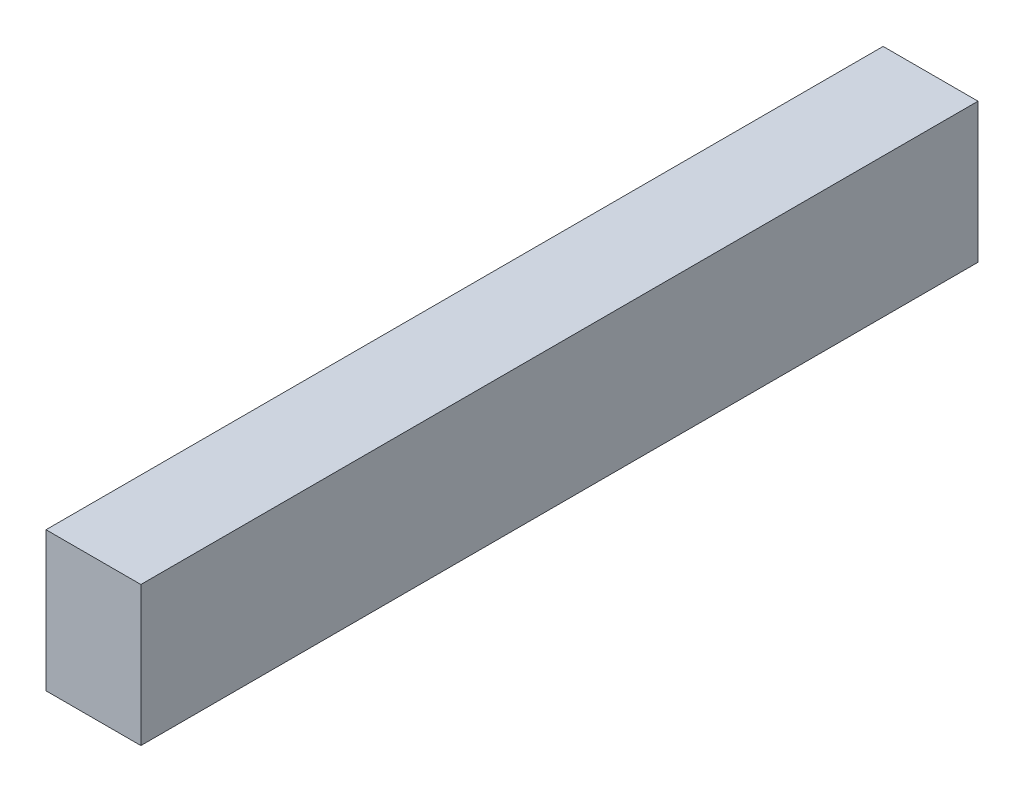
ISO-10303-21;
HEADER;
FILE_DESCRIPTION(('STEP AP214'),'2;1');
FILE_NAME('part.step','',(''),(''),'','','');
FILE_SCHEMA(('AUTOMOTIVE_DESIGN { 1 0 10303 214 1 1 1 1 }'));
ENDSEC;
DATA;
#1=APPLICATION_CONTEXT('core data for automotive mechanical design processes');
#2=APPLICATION_PROTOCOL_DEFINITION('international standard','automotive_design',2000,#1);
#3=PRODUCT_CONTEXT('',#1,'mechanical');
#4=PRODUCT('Part','Part','',(#3));
#5=PRODUCT_RELATED_PRODUCT_CATEGORY('part','',(#4));
#6=PRODUCT_DEFINITION_FORMATION('','',#4);
#7=PRODUCT_DEFINITION_CONTEXT('part definition',#1,'design');
#8=PRODUCT_DEFINITION('design','',#6,#7);
#9=PRODUCT_DEFINITION_SHAPE('','',#8);
#10=(LENGTH_UNIT() NAMED_UNIT(*) SI_UNIT(.MILLI.,.METRE.));
#11=(NAMED_UNIT(*) PLANE_ANGLE_UNIT() SI_UNIT($,.RADIAN.));
#12=(NAMED_UNIT(*) SI_UNIT($,.STERADIAN.) SOLID_ANGLE_UNIT());
#13=UNCERTAINTY_MEASURE_WITH_UNIT(LENGTH_MEASURE(1.E-05),#10,'distance_accuracy_value','');
#14=(GEOMETRIC_REPRESENTATION_CONTEXT(3) GLOBAL_UNCERTAINTY_ASSIGNED_CONTEXT((#13)) GLOBAL_UNIT_ASSIGNED_CONTEXT((#10,
#11,#12)) REPRESENTATION_CONTEXT('',''));
#15=CARTESIAN_POINT('',(0.,0.,0.));
#16=DIRECTION('',(0.,0.,1.));
#17=DIRECTION('',(1.,0.,0.));
#18=AXIS2_PLACEMENT_3D('',#15,#16,#17);
#19=CARTESIAN_POINT('',(8.,0.,0.));
#20=DIRECTION('',(-1.,0.,0.));
#21=DIRECTION('',(0.,-1.,0.));
#22=AXIS2_PLACEMENT_3D('',#19,#20,#21);
#23=PLANE('',#22);
#24=DIRECTION('',(0.,-1.,0.));
#25=VECTOR('',#24,1.);
#26=CARTESIAN_POINT('',(8.,-1.24999999999997,150.));
#27=LINE('',#26,#25);
#28=CARTESIAN_POINT('',(8.,-1.24999999999997,150.));
#29=VERTEX_POINT('',#28);
#30=CARTESIAN_POINT('',(8.,-1.75,150.));
#31=VERTEX_POINT('',#30);
#32=EDGE_CURVE('E71',#29,#31,#27,.T.);
#33=ORIENTED_EDGE('',*,*,#32,.F.);
#34=DIRECTION('',(0.,0.,1.));
#35=VECTOR('',#34,1.);
#36=CARTESIAN_POINT('',(8.,-1.25000000000003,220.));
#37=LINE('',#36,#35);
#38=CARTESIAN_POINT('',(8.,-1.25000000000003,220.));
#39=VERTEX_POINT('',#38);
#40=EDGE_CURVE('E76',#29,#39,#37,.T.);
#41=ORIENTED_EDGE('',*,*,#40,.T.);
#42=DIRECTION('',(0.,-1.,0.));
#43=VECTOR('',#42,1.);
#44=CARTESIAN_POINT('',(8.,-1.25000000000003,220.));
#45=LINE('',#44,#43);
#46=CARTESIAN_POINT('',(8.,-1.5,220.));
#47=VERTEX_POINT('',#46);
#48=EDGE_CURVE('E228',#39,#47,#45,.T.);
#49=ORIENTED_EDGE('',*,*,#48,.T.);
#50=DIRECTION('',(0.,0.,1.));
#51=VECTOR('',#50,1.);
#52=CARTESIAN_POINT('',(8.,-1.5,220.));
#53=LINE('',#52,#51);
#54=CARTESIAN_POINT('',(8.,-1.50000000000001,250.));
#55=VERTEX_POINT('',#54);
#56=EDGE_CURVE('E379',#47,#55,#53,.T.);
#57=ORIENTED_EDGE('',*,*,#56,.T.);
#58=DIRECTION('',(0.,1.,0.));
#59=VECTOR('',#58,1.);
#60=CARTESIAN_POINT('',(8.,-1.5,250.));
#61=LINE('',#60,#59);
#62=CARTESIAN_POINT('',(8.,1.5,250.));
#63=VERTEX_POINT('',#62);
#64=EDGE_CURVE('E265',#55,#63,#61,.T.);
#65=ORIENTED_EDGE('',*,*,#64,.T.);
#66=DIRECTION('',(0.,0.,1.));
#67=VECTOR('',#66,1.);
#68=CARTESIAN_POINT('',(8.,1.49999999999996,0.));
#69=LINE('',#68,#67);
#70=CARTESIAN_POINT('',(8.,1.5,220.));
#71=VERTEX_POINT('',#70);
#72=EDGE_CURVE('E367',#71,#63,#69,.T.);
#73=ORIENTED_EDGE('',*,*,#72,.F.);
#74=DIRECTION('',(0.,1.,0.));
#75=VECTOR('',#74,1.);
#76=CARTESIAN_POINT('',(8.,1.25000000000003,220.));
#77=LINE('',#76,#75);
#78=CARTESIAN_POINT('',(8.,1.25000000000003,220.));
#79=VERTEX_POINT('',#78);
#80=EDGE_CURVE('E280',#79,#71,#77,.T.);
#81=ORIENTED_EDGE('',*,*,#80,.F.);
#82=DIRECTION('',(0.,0.,1.));
#83=VECTOR('',#82,1.);
#84=CARTESIAN_POINT('',(8.,1.25000000000003,220.));
#85=LINE('',#84,#83);
#86=CARTESIAN_POINT('',(8.,1.24999999999997,150.));
#87=VERTEX_POINT('',#86);
#88=EDGE_CURVE('E272',#87,#79,#85,.T.);
#89=ORIENTED_EDGE('',*,*,#88,.F.);
#90=DIRECTION('',(0.,1.,0.));
#91=VECTOR('',#90,1.);
#92=CARTESIAN_POINT('',(8.,1.24999999999997,150.));
#93=LINE('',#92,#91);
#94=CARTESIAN_POINT('',(8.,1.75,150.));
#95=VERTEX_POINT('',#94);
#96=EDGE_CURVE('E282',#87,#95,#93,.T.);
#97=ORIENTED_EDGE('',*,*,#96,.T.);
#98=DIRECTION('',(0.,0.,1.));
#99=VECTOR('',#98,1.);
#100=CARTESIAN_POINT('',(8.,1.75,150.));
#101=LINE('',#100,#99);
#102=CARTESIAN_POINT('',(8.,1.75,80.));
#103=VERTEX_POINT('',#102);
#104=EDGE_CURVE('E286',#103,#95,#101,.T.);
#105=ORIENTED_EDGE('',*,*,#104,.F.);
#106=DIRECTION('',(0.,1.,0.));
#107=VECTOR('',#106,1.);
#108=CARTESIAN_POINT('',(8.,1.75,80.));
#109=LINE('',#108,#107);
#110=CARTESIAN_POINT('',(8.,2.75,80.));
#111=VERTEX_POINT('',#110);
#112=EDGE_CURVE('E294',#103,#111,#109,.T.);
#113=ORIENTED_EDGE('',*,*,#112,.T.);
#114=DIRECTION('',(0.,-0.3407993236214,0.940136065162483));
#115=VECTOR('',#114,1.);
#116=CARTESIAN_POINT('',(7.99999999999999,28.0624223173595,10.1726280900428));
#117=LINE('',#116,#115);
#118=CARTESIAN_POINT('',(8.,10.,60.));
#119=VERTEX_POINT('',#118);
#120=EDGE_CURVE('E316',#119,#111,#117,.T.);
#121=ORIENTED_EDGE('',*,*,#120,.F.);
#122=DIRECTION('',(0.,0.,-1.));
#123=VECTOR('',#122,1.);
#124=CARTESIAN_POINT('',(8.,10.,0.));
#125=LINE('',#124,#123);
#126=CARTESIAN_POINT('',(8.,10.,0.));
#127=VERTEX_POINT('',#126);
#128=EDGE_CURVE('E319',#119,#127,#125,.T.);
#129=ORIENTED_EDGE('',*,*,#128,.T.);
#130=DIRECTION('',(0.,-1.,0.));
#131=VECTOR('',#130,1.);
#132=CARTESIAN_POINT('',(8.,0.,0.));
#133=LINE('',#132,#131);
#134=CARTESIAN_POINT('',(8.,-10.,0.));
#135=VERTEX_POINT('',#134);
#136=EDGE_CURVE('E306',#127,#135,#133,.T.);
#137=ORIENTED_EDGE('',*,*,#136,.T.);
#138=DIRECTION('',(0.,0.,1.));
#139=VECTOR('',#138,1.);
#140=CARTESIAN_POINT('',(8.,-10.,0.));
#141=LINE('',#140,#139);
#142=CARTESIAN_POINT('',(8.,-10.,60.));
#143=VERTEX_POINT('',#142);
#144=EDGE_CURVE('E309',#135,#143,#141,.T.);
#145=ORIENTED_EDGE('',*,*,#144,.T.);
#146=DIRECTION('',(0.,0.3407993236214,0.940136065162483));
#147=VECTOR('',#146,1.);
#148=CARTESIAN_POINT('',(8.,-28.0624223173595,10.1726280900428));
#149=LINE('',#148,#147);
#150=CARTESIAN_POINT('',(8.,-2.75,80.));
#151=VERTEX_POINT('',#150);
#152=EDGE_CURVE('E313',#143,#151,#149,.T.);
#153=ORIENTED_EDGE('',*,*,#152,.T.);
#154=DIRECTION('',(0.,-1.,0.));
#155=VECTOR('',#154,1.);
#156=CARTESIAN_POINT('',(8.,-1.75,80.));
#157=LINE('',#156,#155);
#158=CARTESIAN_POINT('',(8.,-1.75,80.));
#159=VERTEX_POINT('',#158);
#160=EDGE_CURVE('E260',#159,#151,#157,.T.);
#161=ORIENTED_EDGE('',*,*,#160,.F.);
#162=DIRECTION('',(0.,0.,1.));
#163=VECTOR('',#162,1.);
#164=CARTESIAN_POINT('',(8.,-1.75,150.));
#165=LINE('',#164,#163);
#166=EDGE_CURVE('E244',#159,#31,#165,.T.);
#167=ORIENTED_EDGE('',*,*,#166,.T.);
#168=EDGE_LOOP('',(#33,#41,#49,#57,#65,#73,#81,#89,#97,#105,#113,#121,#129,#137,#145,#153,#161,#167));
#169=FACE_BOUND('',#168,.T.);
#170=ADVANCED_FACE('F56',(#169),#23,.T.);
#171=CARTESIAN_POINT('',(8.,1.49999999999996,0.));
#172=DIRECTION('',(0.,-1.,0.));
#173=DIRECTION('',(0.,0.,-1.));
#174=AXIS2_PLACEMENT_3D('',#171,#172,#173);
#175=PLANE('',#174);
#176=ORIENTED_EDGE('',*,*,#72,.T.);
#177=DIRECTION('',(0.52999894000318,0.,-0.847998304005088));
#178=VECTOR('',#177,1.);
#179=CARTESIAN_POINT('',(-17.,1.50000000000001,290.));
#180=LINE('',#179,#178);
#181=CARTESIAN_POINT('',(-17.,1.50000000000001,290.));
#182=VERTEX_POINT('',#181);
#183=EDGE_CURVE('E262',#182,#63,#180,.T.);
#184=ORIENTED_EDGE('',*,*,#183,.F.);
#185=DIRECTION('',(0.,0.,1.));
#186=VECTOR('',#185,1.);
#187=CARTESIAN_POINT('',(-17.,1.49999999999996,0.));
#188=LINE('',#187,#186);
#189=CARTESIAN_POINT('',(-17.,1.5,220.));
#190=VERTEX_POINT('',#189);
#191=EDGE_CURVE('E372',#190,#182,#188,.T.);
#192=ORIENTED_EDGE('',*,*,#191,.F.);
#193=DIRECTION('',(-1.,0.,0.));
#194=VECTOR('',#193,1.);
#195=CARTESIAN_POINT('',(8.,1.5,220.));
#196=LINE('',#195,#194);
#197=EDGE_CURVE('E370',#71,#190,#196,.T.);
#198=ORIENTED_EDGE('',*,*,#197,.F.);
#199=EDGE_LOOP('',(#176,#184,#192,#198));
#200=FACE_BOUND('',#199,.T.);
#201=ADVANCED_FACE('F465',(#200),#175,.T.);
#202=CARTESIAN_POINT('',(8.,-1.5,220.));
#203=DIRECTION('',(0.,-1.,0.));
#204=DIRECTION('',(1.,0.,0.));
#205=AXIS2_PLACEMENT_3D('',#202,#203,#204);
#206=PLANE('',#205);
#207=DIRECTION('',(0.52999894000318,0.,-0.847998304005088));
#208=VECTOR('',#207,1.);
#209=CARTESIAN_POINT('',(-17.,-1.49999999999999,290.));
#210=LINE('',#209,#208);
#211=CARTESIAN_POINT('',(-17.,-1.49999999999999,290.));
#212=VERTEX_POINT('',#211);
#213=EDGE_CURVE('E263',#212,#55,#210,.T.);
#214=ORIENTED_EDGE('',*,*,#213,.T.);
#215=ORIENTED_EDGE('',*,*,#56,.F.);
#216=DIRECTION('',(-1.,0.,0.));
#217=VECTOR('',#216,1.);
#218=CARTESIAN_POINT('',(8.,-1.5,220.));
#219=LINE('',#218,#217);
#220=CARTESIAN_POINT('',(-17.,-1.5,220.));
#221=VERTEX_POINT('',#220);
#222=EDGE_CURVE('E375',#47,#221,#219,.T.);
#223=ORIENTED_EDGE('',*,*,#222,.T.);
#224=DIRECTION('',(0.,0.,1.));
#225=VECTOR('',#224,1.);
#226=CARTESIAN_POINT('',(-17.,-1.50000000000001,220.));
#227=LINE('',#226,#225);
#228=EDGE_CURVE('E364',#221,#212,#227,.T.);
#229=ORIENTED_EDGE('',*,*,#228,.T.);
#230=EDGE_LOOP('',(#214,#215,#223,#229));
#231=FACE_BOUND('',#230,.T.);
#232=ADVANCED_FACE('F472',(#231),#206,.F.);
#233=CARTESIAN_POINT('',(8.,2.24999999999997,150.));
#234=DIRECTION('',(0.,1.,0.));
#235=DIRECTION('',(0.,0.,1.));
#236=AXIS2_PLACEMENT_3D('',#233,#234,#235);
#237=PLANE('',#236);
#238=DIRECTION('',(0.336336396998156,0.,-0.941741911594838));
#239=VECTOR('',#238,1.);
#240=CARTESIAN_POINT('',(-17.,2.25000000000003,220.));
#241=LINE('',#240,#239);
#242=CARTESIAN_POINT('',(-17.,2.25000000000003,220.));
#243=VERTEX_POINT('',#242);
#244=CARTESIAN_POINT('',(8.,2.24999999999997,150.));
#245=VERTEX_POINT('',#244);
#246=EDGE_CURVE('E269',#243,#245,#241,.T.);
#247=ORIENTED_EDGE('',*,*,#246,.F.);
#248=DIRECTION('',(0.,0.,-1.));
#249=VECTOR('',#248,1.);
#250=CARTESIAN_POINT('',(-17.,2.24999999999997,150.));
#251=LINE('',#250,#249);
#252=CARTESIAN_POINT('',(-17.,2.24999999999997,150.));
#253=VERTEX_POINT('',#252);
#254=EDGE_CURVE('E357',#243,#253,#251,.T.);
#255=ORIENTED_EDGE('',*,*,#254,.T.);
#256=DIRECTION('',(-1.,0.,0.));
#257=VECTOR('',#256,1.);
#258=CARTESIAN_POINT('',(8.,2.24999999999997,150.));
#259=LINE('',#258,#257);
#260=EDGE_CURVE('E361',#245,#253,#259,.T.);
#261=ORIENTED_EDGE('',*,*,#260,.F.);
#262=EDGE_LOOP('',(#247,#255,#261));
#263=FACE_BOUND('',#262,.T.);
#264=ADVANCED_FACE('F444',(#263),#237,.F.);
#265=CARTESIAN_POINT('',(8.,2.75,80.));
#266=DIRECTION('',(0.,1.,0.));
#267=DIRECTION('',(-1.,0.,0.));
#268=AXIS2_PLACEMENT_3D('',#265,#266,#267);
#269=PLANE('',#268);
#270=DIRECTION('',(0.336336396998156,0.,-0.941741911594837));
#271=VECTOR('',#270,1.);
#272=CARTESIAN_POINT('',(8.,2.75,80.));
#273=LINE('',#272,#271);
#274=CARTESIAN_POINT('',(-17.,2.75,150.));
#275=VERTEX_POINT('',#274);
#276=EDGE_CURVE('E285',#275,#111,#273,.T.);
#277=ORIENTED_EDGE('',*,*,#276,.F.);
#278=DIRECTION('',(0.,0.,-1.));
#279=VECTOR('',#278,1.);
#280=CARTESIAN_POINT('',(-17.,2.75,80.));
#281=LINE('',#280,#279);
#282=CARTESIAN_POINT('',(-17.,2.75,80.));
#283=VERTEX_POINT('',#282);
#284=EDGE_CURVE('E345',#275,#283,#281,.T.);
#285=ORIENTED_EDGE('',*,*,#284,.T.);
#286=DIRECTION('',(-1.,0.,0.));
#287=VECTOR('',#286,1.);
#288=CARTESIAN_POINT('',(8.,2.75,80.));
#289=LINE('',#288,#287);
#290=EDGE_CURVE('E349',#111,#283,#289,.T.);
#291=ORIENTED_EDGE('',*,*,#290,.F.);
#292=EDGE_LOOP('',(#277,#285,#291));
#293=FACE_BOUND('',#292,.T.);
#294=ADVANCED_FACE('F434',(#293),#269,.F.);
#295=CARTESIAN_POINT('',(-17.,25.,300.));
#296=DIRECTION('',(1.,0.,0.));
#297=DIRECTION('',(0.,1.,0.));
#298=AXIS2_PLACEMENT_3D('',#295,#296,#297);
#299=PLANE('',#298);
#300=DIRECTION('',(0.,-1.,0.));
#301=VECTOR('',#300,1.);
#302=CARTESIAN_POINT('',(-17.,25.,0.));
#303=LINE('',#302,#301);
#304=CARTESIAN_POINT('',(-17.,25.,0.));
#305=VERTEX_POINT('',#304);
#306=CARTESIAN_POINT('',(-17.,10.,0.));
#307=VERTEX_POINT('',#306);
#308=EDGE_CURVE('E401',#305,#307,#303,.T.);
#309=ORIENTED_EDGE('',*,*,#308,.T.);
#310=DIRECTION('',(0.,0.,-1.));
#311=VECTOR('',#310,1.);
#312=CARTESIAN_POINT('',(-17.,10.,0.));
#313=LINE('',#312,#311);
#314=CARTESIAN_POINT('',(-17.,10.,60.));
#315=VERTEX_POINT('',#314);
#316=EDGE_CURVE('E310',#315,#307,#313,.T.);
#317=ORIENTED_EDGE('',*,*,#316,.F.);
#318=DIRECTION('',(0.,-0.3407993236214,0.940136065162483));
#319=VECTOR('',#318,1.);
#320=CARTESIAN_POINT('',(-17.,28.0624223173595,10.1726280900428));
#321=LINE('',#320,#319);
#322=EDGE_CURVE('E327',#315,#283,#321,.T.);
#323=ORIENTED_EDGE('',*,*,#322,.T.);
#324=ORIENTED_EDGE('',*,*,#284,.F.);
#325=DIRECTION('',(0.,1.,0.));
#326=VECTOR('',#325,1.);
#327=CARTESIAN_POINT('',(-17.,2.75,150.));
#328=LINE('',#327,#326);
#329=EDGE_CURVE('E342',#253,#275,#328,.T.);
#330=ORIENTED_EDGE('',*,*,#329,.F.);
#331=ORIENTED_EDGE('',*,*,#254,.F.);
#332=DIRECTION('',(0.,1.,0.));
#333=VECTOR('',#332,1.);
#334=CARTESIAN_POINT('',(-17.,2.25000000000003,220.));
#335=LINE('',#334,#333);
#336=EDGE_CURVE('E355',#190,#243,#335,.T.);
#337=ORIENTED_EDGE('',*,*,#336,.F.);
#338=ORIENTED_EDGE('',*,*,#191,.T.);
#339=DIRECTION('',(0.,-1.,0.));
#340=VECTOR('',#339,1.);
#341=CARTESIAN_POINT('',(-17.,0.,290.));
#342=LINE('',#341,#340);
#343=EDGE_CURVE('E371',#182,#212,#342,.T.);
#344=ORIENTED_EDGE('',*,*,#343,.T.);
#345=ORIENTED_EDGE('',*,*,#228,.F.);
#346=CARTESIAN_POINT('',(-17.,-2.25000000000003,220.));
#347=VERTEX_POINT('',#346);
#348=EDGE_CURVE('E223',#347,#221,#335,.T.);
#349=ORIENTED_EDGE('',*,*,#348,.F.);
#350=DIRECTION('',(0.,0.,1.));
#351=VECTOR('',#350,1.);
#352=CARTESIAN_POINT('',(-17.,-2.25000000000003,150.));
#353=LINE('',#352,#351);
#354=CARTESIAN_POINT('',(-17.,-2.25000000000003,150.));
#355=VERTEX_POINT('',#354);
#356=EDGE_CURVE('E351',#355,#347,#353,.T.);
#357=ORIENTED_EDGE('',*,*,#356,.F.);
#358=CARTESIAN_POINT('',(-17.,-2.75,150.));
#359=VERTEX_POINT('',#358);
#360=EDGE_CURVE('E343',#359,#355,#328,.T.);
#361=ORIENTED_EDGE('',*,*,#360,.F.);
#362=DIRECTION('',(0.,0.,1.));
#363=VECTOR('',#362,1.);
#364=CARTESIAN_POINT('',(-17.,-2.75,80.));
#365=LINE('',#364,#363);
#366=CARTESIAN_POINT('',(-17.,-2.75,80.));
#367=VERTEX_POINT('',#366);
#368=EDGE_CURVE('E334',#367,#359,#365,.T.);
#369=ORIENTED_EDGE('',*,*,#368,.F.);
#370=DIRECTION('',(0.,0.3407993236214,0.940136065162483));
#371=VECTOR('',#370,1.);
#372=CARTESIAN_POINT('',(-17.,-28.0624223173595,10.1726280900428));
#373=LINE('',#372,#371);
#374=CARTESIAN_POINT('',(-17.,-10.,60.));
#375=VERTEX_POINT('',#374);
#376=EDGE_CURVE('E325',#375,#367,#373,.T.);
#377=ORIENTED_EDGE('',*,*,#376,.F.);
#378=DIRECTION('',(0.,0.,1.));
#379=VECTOR('',#378,1.);
#380=CARTESIAN_POINT('',(-17.,-10.,0.));
#381=LINE('',#380,#379);
#382=CARTESIAN_POINT('',(-17.,-10.,0.));
#383=VERTEX_POINT('',#382);
#384=EDGE_CURVE('E305',#383,#375,#381,.T.);
#385=ORIENTED_EDGE('',*,*,#384,.F.);
#386=CARTESIAN_POINT('',(-17.,-25.,0.));
#387=VERTEX_POINT('',#386);
#388=EDGE_CURVE('E400',#383,#387,#303,.T.);
#389=ORIENTED_EDGE('',*,*,#388,.T.);
#390=DIRECTION('',(0.,0.,-1.));
#391=VECTOR('',#390,1.);
#392=CARTESIAN_POINT('',(-17.,-25.,300.));
#393=LINE('',#392,#391);
#394=CARTESIAN_POINT('',(-17.,-25.,300.));
#395=VERTEX_POINT('',#394);
#396=EDGE_CURVE('E407',#395,#387,#393,.T.);
#397=ORIENTED_EDGE('',*,*,#396,.F.);
#398=DIRECTION('',(0.,-1.,0.));
#399=VECTOR('',#398,1.);
#400=CARTESIAN_POINT('',(-17.,25.,300.));
#401=LINE('',#400,#399);
#402=CARTESIAN_POINT('',(-17.,25.,300.));
#403=VERTEX_POINT('',#402);
#404=EDGE_CURVE('E391',#403,#395,#401,.T.);
#405=ORIENTED_EDGE('',*,*,#404,.F.);
#406=DIRECTION('',(0.,0.,-1.));
#407=VECTOR('',#406,1.);
#408=CARTESIAN_POINT('',(-17.,25.,300.));
#409=LINE('',#408,#407);
#410=EDGE_CURVE('E64',#403,#305,#409,.T.);
#411=ORIENTED_EDGE('',*,*,#410,.T.);
#412=EDGE_LOOP('',(#309,#317,#323,#324,#330,#331,#337,#338,#344,#345,#349,#357,#361,#369,#377,
#385,#389,#397,#405,#411));
#413=FACE_BOUND('',#412,.T.);
#414=ADVANCED_FACE('F414',(#413),#299,.F.);
#415=CARTESIAN_POINT('',(17.,25.,300.));
#416=DIRECTION('',(-1.,0.,0.));
#417=DIRECTION('',(0.,-1.,0.));
#418=AXIS2_PLACEMENT_3D('',#415,#416,#417);
#419=PLANE('',#418);
#420=DIRECTION('',(0.,1.,0.));
#421=VECTOR('',#420,1.);
#422=CARTESIAN_POINT('',(17.,25.,0.));
#423=LINE('',#422,#421);
#424=CARTESIAN_POINT('',(17.,-25.,0.));
#425=VERTEX_POINT('',#424);
#426=CARTESIAN_POINT('',(17.,25.,0.));
#427=VERTEX_POINT('',#426);
#428=EDGE_CURVE('E378',#425,#427,#423,.T.);
#429=ORIENTED_EDGE('',*,*,#428,.T.);
#430=DIRECTION('',(0.,0.,-1.));
#431=VECTOR('',#430,1.);
#432=CARTESIAN_POINT('',(17.,25.,300.));
#433=LINE('',#432,#431);
#434=CARTESIAN_POINT('',(17.,25.,300.));
#435=VERTEX_POINT('',#434);
#436=EDGE_CURVE('E12',#435,#427,#433,.T.);
#437=ORIENTED_EDGE('',*,*,#436,.F.);
#438=DIRECTION('',(0.,1.,0.));
#439=VECTOR('',#438,1.);
#440=CARTESIAN_POINT('',(17.,25.,300.));
#441=LINE('',#440,#439);
#442=CARTESIAN_POINT('',(17.,-25.,300.));
#443=VERTEX_POINT('',#442);
#444=EDGE_CURVE('E385',#443,#435,#441,.T.);
#445=ORIENTED_EDGE('',*,*,#444,.F.);
#446=DIRECTION('',(0.,0.,-1.));
#447=VECTOR('',#446,1.);
#448=CARTESIAN_POINT('',(17.,-25.,300.));
#449=LINE('',#448,#447);
#450=EDGE_CURVE('E395',#443,#425,#449,.T.);
#451=ORIENTED_EDGE('',*,*,#450,.T.);
#452=EDGE_LOOP('',(#429,#437,#445,#451));
#453=FACE_BOUND('',#452,.T.);
#454=ADVANCED_FACE('F58',(#453),#419,.F.);
#455=CARTESIAN_POINT('',(-17.,25.,300.));
#456=DIRECTION('',(0.,-1.,0.));
#457=DIRECTION('',(0.,0.,-1.));
#458=AXIS2_PLACEMENT_3D('',#455,#456,#457);
#459=PLANE('',#458);
#460=DIRECTION('',(-1.,0.,0.));
#461=VECTOR('',#460,1.);
#462=CARTESIAN_POINT('',(-17.,25.,0.));
#463=LINE('',#462,#461);
#464=EDGE_CURVE('E398',#427,#305,#463,.T.);
#465=ORIENTED_EDGE('',*,*,#464,.T.);
#466=ORIENTED_EDGE('',*,*,#410,.F.);
#467=DIRECTION('',(-1.,0.,0.));
#468=VECTOR('',#467,1.);
#469=CARTESIAN_POINT('',(-17.,25.,300.));
#470=LINE('',#469,#468);
#471=EDGE_CURVE('E388',#435,#403,#470,.T.);
#472=ORIENTED_EDGE('',*,*,#471,.F.);
#473=ORIENTED_EDGE('',*,*,#436,.T.);
#474=EDGE_LOOP('',(#465,#466,#472,#473));
#475=FACE_BOUND('',#474,.T.);
#476=ADVANCED_FACE('F641',(#475),#459,.F.);
#477=CARTESIAN_POINT('',(-17.,-25.,300.));
#478=DIRECTION('',(0.,1.,0.));
#479=DIRECTION('',(0.,0.,1.));
#480=AXIS2_PLACEMENT_3D('',#477,#478,#479);
#481=PLANE('',#480);
#482=DIRECTION('',(1.,0.,0.));
#483=VECTOR('',#482,1.);
#484=CARTESIAN_POINT('',(-17.,-25.,0.));
#485=LINE('',#484,#483);
#486=EDGE_CURVE('E389',#387,#425,#485,.T.);
#487=ORIENTED_EDGE('',*,*,#486,.T.);
#488=ORIENTED_EDGE('',*,*,#450,.F.);
#489=DIRECTION('',(1.,0.,0.));
#490=VECTOR('',#489,1.);
#491=CARTESIAN_POINT('',(-17.,-25.,300.));
#492=LINE('',#491,#490);
#493=EDGE_CURVE('E393',#395,#443,#492,.T.);
#494=ORIENTED_EDGE('',*,*,#493,.F.);
#495=ORIENTED_EDGE('',*,*,#396,.T.);
#496=EDGE_LOOP('',(#487,#488,#494,#495));
#497=FACE_BOUND('',#496,.T.);
#498=ADVANCED_FACE('F634',(#497),#481,.F.);
#499=CARTESIAN_POINT('',(0.,0.,300.));
#500=DIRECTION('',(0.,0.,1.));
#501=DIRECTION('',(1.,0.,0.));
#502=AXIS2_PLACEMENT_3D('',#499,#500,#501);
#503=PLANE('',#502);
#504=ORIENTED_EDGE('',*,*,#444,.T.);
#505=ORIENTED_EDGE('',*,*,#471,.T.);
#506=ORIENTED_EDGE('',*,*,#404,.T.);
#507=ORIENTED_EDGE('',*,*,#493,.T.);
#508=EDGE_LOOP('',(#504,#505,#506,#507));
#509=FACE_BOUND('',#508,.T.);
#510=ADVANCED_FACE('F627',(#509),#503,.T.);
#511=CARTESIAN_POINT('',(0.,0.,0.));
#512=DIRECTION('',(0.,0.,1.));
#513=DIRECTION('',(1.,0.,0.));
#514=AXIS2_PLACEMENT_3D('',#511,#512,#513);
#515=PLANE('',#514);
#516=ORIENTED_EDGE('',*,*,#136,.F.);
#517=DIRECTION('',(-1.,0.,0.));
#518=VECTOR('',#517,1.);
#519=CARTESIAN_POINT('',(8.,10.,0.));
#520=LINE('',#519,#518);
#521=EDGE_CURVE('E331',#127,#307,#520,.T.);
#522=ORIENTED_EDGE('',*,*,#521,.T.);
#523=ORIENTED_EDGE('',*,*,#308,.F.);
#524=ORIENTED_EDGE('',*,*,#464,.F.);
#525=ORIENTED_EDGE('',*,*,#428,.F.);
#526=ORIENTED_EDGE('',*,*,#486,.F.);
#527=ORIENTED_EDGE('',*,*,#388,.F.);
#528=DIRECTION('',(-1.,0.,0.));
#529=VECTOR('',#528,1.);
#530=CARTESIAN_POINT('',(8.,-10.,0.));
#531=LINE('',#530,#529);
#532=EDGE_CURVE('E322',#135,#383,#531,.T.);
#533=ORIENTED_EDGE('',*,*,#532,.F.);
#534=EDGE_LOOP('',(#516,#522,#523,#524,#525,#526,#527,#533));
#535=FACE_BOUND('',#534,.T.);
#536=ADVANCED_FACE('F420',(#535),#515,.F.);
#537=CARTESIAN_POINT('',(8.,-2.25000000000003,150.));
#538=DIRECTION('',(0.,-1.,0.));
#539=DIRECTION('',(1.,0.,0.));
#540=AXIS2_PLACEMENT_3D('',#537,#538,#539);
#541=PLANE('',#540);
#542=ORIENTED_EDGE('',*,*,#356,.T.);
#543=DIRECTION('',(0.336336396998156,0.,-0.941741911594838));
#544=VECTOR('',#543,1.);
#545=CARTESIAN_POINT('',(-17.,-2.25000000000003,220.));
#546=LINE('',#545,#544);
#547=CARTESIAN_POINT('',(8.,-2.24999999999997,150.));
#548=VERTEX_POINT('',#547);
#549=EDGE_CURVE('E234',#347,#548,#546,.T.);
#550=ORIENTED_EDGE('',*,*,#549,.T.);
#551=DIRECTION('',(-1.,0.,0.));
#552=VECTOR('',#551,1.);
#553=CARTESIAN_POINT('',(8.,-2.25000000000003,150.));
#554=LINE('',#553,#552);
#555=EDGE_CURVE('E360',#548,#355,#554,.T.);
#556=ORIENTED_EDGE('',*,*,#555,.T.);
#557=EDGE_LOOP('',(#542,#550,#556));
#558=FACE_BOUND('',#557,.T.);
#559=ADVANCED_FACE('F488',(#558),#541,.F.);
#560=CARTESIAN_POINT('',(8.,-2.75,80.));
#561=DIRECTION('',(0.,-1.,0.));
#562=DIRECTION('',(1.,0.,0.));
#563=AXIS2_PLACEMENT_3D('',#560,#561,#562);
#564=PLANE('',#563);
#565=ORIENTED_EDGE('',*,*,#368,.T.);
#566=DIRECTION('',(0.336336396998156,0.,-0.941741911594837));
#567=VECTOR('',#566,1.);
#568=CARTESIAN_POINT('',(8.,-2.75,80.));
#569=LINE('',#568,#567);
#570=EDGE_CURVE('E227',#359,#151,#569,.T.);
#571=ORIENTED_EDGE('',*,*,#570,.T.);
#572=DIRECTION('',(-1.,0.,0.));
#573=VECTOR('',#572,1.);
#574=CARTESIAN_POINT('',(8.,-2.75,80.));
#575=LINE('',#574,#573);
#576=EDGE_CURVE('E348',#151,#367,#575,.T.);
#577=ORIENTED_EDGE('',*,*,#576,.T.);
#578=EDGE_LOOP('',(#565,#571,#577));
#579=FACE_BOUND('',#578,.T.);
#580=ADVANCED_FACE('F490',(#579),#564,.F.);
#581=CARTESIAN_POINT('',(8.,10.,0.));
#582=DIRECTION('',(0.,1.,0.));
#583=DIRECTION('',(-1.,0.,0.));
#584=AXIS2_PLACEMENT_3D('',#581,#582,#583);
#585=PLANE('',#584);
#586=ORIENTED_EDGE('',*,*,#316,.T.);
#587=ORIENTED_EDGE('',*,*,#521,.F.);
#588=ORIENTED_EDGE('',*,*,#128,.F.);
#589=DIRECTION('',(-1.,0.,0.));
#590=VECTOR('',#589,1.);
#591=CARTESIAN_POINT('',(8.,10.,60.));
#592=LINE('',#591,#590);
#593=EDGE_CURVE('E335',#119,#315,#592,.T.);
#594=ORIENTED_EDGE('',*,*,#593,.T.);
#595=EDGE_LOOP('',(#586,#587,#588,#594));
#596=FACE_BOUND('',#595,.T.);
#597=ADVANCED_FACE('F425',(#596),#585,.F.);
#598=CARTESIAN_POINT('',(7.99999999999999,28.0624223173595,10.1726280900428));
#599=DIRECTION('',(0.,-0.940136065162483,-0.3407993236214));
#600=DIRECTION('',(0.,0.3407993236214,-0.940136065162483));
#601=AXIS2_PLACEMENT_3D('',#598,#599,#600);
#602=PLANE('',#601);
#603=ORIENTED_EDGE('',*,*,#322,.F.);
#604=ORIENTED_EDGE('',*,*,#593,.F.);
#605=ORIENTED_EDGE('',*,*,#120,.T.);
#606=ORIENTED_EDGE('',*,*,#290,.T.);
#607=EDGE_LOOP('',(#603,#604,#605,#606));
#608=FACE_BOUND('',#607,.T.);
#609=ADVANCED_FACE('F430',(#608),#602,.T.);
#610=CARTESIAN_POINT('',(8.,-28.0624223173595,10.1726280900428));
#611=DIRECTION('',(0.,-0.940136065162483,0.3407993236214));
#612=DIRECTION('',(0.,-0.3407993236214,-0.940136065162483));
#613=AXIS2_PLACEMENT_3D('',#610,#611,#612);
#614=PLANE('',#613);
#615=ORIENTED_EDGE('',*,*,#376,.T.);
#616=ORIENTED_EDGE('',*,*,#576,.F.);
#617=ORIENTED_EDGE('',*,*,#152,.F.);
#618=DIRECTION('',(-1.,0.,0.));
#619=VECTOR('',#618,1.);
#620=CARTESIAN_POINT('',(8.,-10.,60.));
#621=LINE('',#620,#619);
#622=EDGE_CURVE('E337',#143,#375,#621,.T.);
#623=ORIENTED_EDGE('',*,*,#622,.T.);
#624=EDGE_LOOP('',(#615,#616,#617,#623));
#625=FACE_BOUND('',#624,.T.);
#626=ADVANCED_FACE('F501',(#625),#614,.F.);
#627=CARTESIAN_POINT('',(8.,-10.,0.));
#628=DIRECTION('',(0.,-1.,0.));
#629=DIRECTION('',(1.,0.,0.));
#630=AXIS2_PLACEMENT_3D('',#627,#628,#629);
#631=PLANE('',#630);
#632=ORIENTED_EDGE('',*,*,#384,.T.);
#633=ORIENTED_EDGE('',*,*,#622,.F.);
#634=ORIENTED_EDGE('',*,*,#144,.F.);
#635=ORIENTED_EDGE('',*,*,#532,.T.);
#636=EDGE_LOOP('',(#632,#633,#634,#635));
#637=FACE_BOUND('',#636,.T.);
#638=ADVANCED_FACE('F498',(#637),#631,.F.);
#639=CARTESIAN_POINT('',(-17.,1.75,150.));
#640=DIRECTION('',(0.,0.,-1.));
#641=DIRECTION('',(-1.,0.,0.));
#642=AXIS2_PLACEMENT_3D('',#639,#640,#641);
#643=PLANE('',#642);
#644=DIRECTION('',(0.,1.,0.));
#645=VECTOR('',#644,1.);
#646=CARTESIAN_POINT('',(8.,1.75,150.));
#647=LINE('',#646,#645);
#648=EDGE_CURVE('E302',#95,#245,#647,.T.);
#649=ORIENTED_EDGE('',*,*,#648,.T.);
#650=ORIENTED_EDGE('',*,*,#260,.T.);
#651=DIRECTION('',(0.,1.,0.));
#652=VECTOR('',#651,1.);
#653=CARTESIAN_POINT('',(-17.,1.75,150.));
#654=LINE('',#653,#652);
#655=CARTESIAN_POINT('',(-17.,1.75,150.));
#656=VERTEX_POINT('',#655);
#657=EDGE_CURVE('E299',#656,#253,#654,.T.);
#658=ORIENTED_EDGE('',*,*,#657,.F.);
#659=DIRECTION('',(-1.,0.,0.));
#660=VECTOR('',#659,1.);
#661=CARTESIAN_POINT('',(-17.,1.75,150.));
#662=LINE('',#661,#660);
#663=EDGE_CURVE('E289',#95,#656,#662,.T.);
#664=ORIENTED_EDGE('',*,*,#663,.F.);
#665=EDGE_LOOP('',(#649,#650,#658,#664));
#666=FACE_BOUND('',#665,.T.);
#667=ADVANCED_FACE('F446',(#666),#643,.F.);
#668=CARTESIAN_POINT('',(8.,1.75,80.));
#669=DIRECTION('',(0.941741911594837,0.,0.336336396998156));
#670=DIRECTION('',(0.336336396998156,0.,-0.941741911594838));
#671=AXIS2_PLACEMENT_3D('',#668,#669,#670);
#672=PLANE('',#671);
#673=ORIENTED_EDGE('',*,*,#276,.T.);
#674=ORIENTED_EDGE('',*,*,#112,.F.);
#675=DIRECTION('',(0.336336396998156,0.,-0.941741911594837));
#676=VECTOR('',#675,1.);
#677=CARTESIAN_POINT('',(8.,1.75,80.));
#678=LINE('',#677,#676);
#679=EDGE_CURVE('E291',#656,#103,#678,.T.);
#680=ORIENTED_EDGE('',*,*,#679,.F.);
#681=ORIENTED_EDGE('',*,*,#657,.T.);
#682=ORIENTED_EDGE('',*,*,#329,.T.);
#683=EDGE_LOOP('',(#673,#674,#680,#681,#682));
#684=FACE_BOUND('',#683,.T.);
#685=ADVANCED_FACE('F436',(#684),#672,.F.);
#686=CARTESIAN_POINT('',(0.,1.75,0.));
#687=DIRECTION('',(0.,-1.,0.));
#688=DIRECTION('',(1.,0.,0.));
#689=AXIS2_PLACEMENT_3D('',#686,#687,#688);
#690=PLANE('',#689);
#691=ORIENTED_EDGE('',*,*,#104,.T.);
#692=ORIENTED_EDGE('',*,*,#663,.T.);
#693=ORIENTED_EDGE('',*,*,#679,.T.);
#694=EDGE_LOOP('',(#691,#692,#693));
#695=FACE_BOUND('',#694,.T.);
#696=ADVANCED_FACE('F514',(#695),#690,.T.);
#697=CARTESIAN_POINT('',(-17.,1.25000000000003,220.));
#698=DIRECTION('',(0.941741911594838,0.,0.336336396998156));
#699=DIRECTION('',(0.336336396998156,0.,-0.941741911594838));
#700=AXIS2_PLACEMENT_3D('',#697,#698,#699);
#701=PLANE('',#700);
#702=ORIENTED_EDGE('',*,*,#246,.T.);
#703=ORIENTED_EDGE('',*,*,#648,.F.);
#704=ORIENTED_EDGE('',*,*,#96,.F.);
#705=DIRECTION('',(0.336336396998156,0.,-0.941741911594838));
#706=VECTOR('',#705,1.);
#707=CARTESIAN_POINT('',(-17.,1.25000000000003,220.));
#708=LINE('',#707,#706);
#709=CARTESIAN_POINT('',(-17.,1.25000000000003,220.));
#710=VERTEX_POINT('',#709);
#711=EDGE_CURVE('E270',#710,#87,#708,.T.);
#712=ORIENTED_EDGE('',*,*,#711,.F.);
#713=DIRECTION('',(0.,1.,0.));
#714=VECTOR('',#713,1.);
#715=CARTESIAN_POINT('',(-17.,1.25000000000003,220.));
#716=LINE('',#715,#714);
#717=EDGE_CURVE('E276',#710,#190,#716,.T.);
#718=ORIENTED_EDGE('',*,*,#717,.T.);
#719=ORIENTED_EDGE('',*,*,#336,.T.);
#720=EDGE_LOOP('',(#702,#703,#704,#712,#718,#719));
#721=FACE_BOUND('',#720,.T.);
#722=ADVANCED_FACE('F450',(#721),#701,.F.);
#723=CARTESIAN_POINT('',(-17.,1.25000000000003,220.));
#724=DIRECTION('',(0.,0.,-1.));
#725=DIRECTION('',(0.,1.,0.));
#726=AXIS2_PLACEMENT_3D('',#723,#724,#725);
#727=PLANE('',#726);
#728=ORIENTED_EDGE('',*,*,#197,.T.);
#729=ORIENTED_EDGE('',*,*,#717,.F.);
#730=DIRECTION('',(-1.,0.,0.));
#731=VECTOR('',#730,1.);
#732=CARTESIAN_POINT('',(-17.,1.25000000000003,220.));
#733=LINE('',#732,#731);
#734=EDGE_CURVE('E274',#79,#710,#733,.T.);
#735=ORIENTED_EDGE('',*,*,#734,.F.);
#736=ORIENTED_EDGE('',*,*,#80,.T.);
#737=EDGE_LOOP('',(#728,#729,#735,#736));
#738=FACE_BOUND('',#737,.T.);
#739=ADVANCED_FACE('F460',(#738),#727,.F.);
#740=CARTESIAN_POINT('',(0.,1.24999999999984,0.));
#741=DIRECTION('',(0.,-1.,0.));
#742=DIRECTION('',(0.,0.,-1.));
#743=AXIS2_PLACEMENT_3D('',#740,#741,#742);
#744=PLANE('',#743);
#745=ORIENTED_EDGE('',*,*,#711,.T.);
#746=ORIENTED_EDGE('',*,*,#88,.T.);
#747=ORIENTED_EDGE('',*,*,#734,.T.);
#748=EDGE_LOOP('',(#745,#746,#747));
#749=FACE_BOUND('',#748,.T.);
#750=ADVANCED_FACE('F457',(#749),#744,.T.);
#751=CARTESIAN_POINT('',(-17.,-1.49999999999999,290.));
#752=DIRECTION('',(0.847998304005088,0.,0.52999894000318));
#753=DIRECTION('',(0.52999894000318,0.,-0.847998304005088));
#754=AXIS2_PLACEMENT_3D('',#751,#752,#753);
#755=PLANE('',#754);
#756=ORIENTED_EDGE('',*,*,#183,.T.);
#757=ORIENTED_EDGE('',*,*,#64,.F.);
#758=ORIENTED_EDGE('',*,*,#213,.F.);
#759=ORIENTED_EDGE('',*,*,#343,.F.);
#760=EDGE_LOOP('',(#756,#757,#758,#759));
#761=FACE_BOUND('',#760,.T.);
#762=ADVANCED_FACE('F468',(#761),#755,.F.);
#763=CARTESIAN_POINT('',(-17.,-1.75,150.));
#764=DIRECTION('',(0.,0.,1.));
#765=DIRECTION('',(1.,0.,0.));
#766=AXIS2_PLACEMENT_3D('',#763,#764,#765);
#767=PLANE('',#766);
#768=ORIENTED_EDGE('',*,*,#555,.F.);
#769=DIRECTION('',(0.,-1.,0.));
#770=VECTOR('',#769,1.);
#771=CARTESIAN_POINT('',(8.,-1.75,150.));
#772=LINE('',#771,#770);
#773=EDGE_CURVE('E252',#31,#548,#772,.T.);
#774=ORIENTED_EDGE('',*,*,#773,.F.);
#775=DIRECTION('',(-1.,0.,0.));
#776=VECTOR('',#775,1.);
#777=CARTESIAN_POINT('',(-17.,-1.75,150.));
#778=LINE('',#777,#776);
#779=CARTESIAN_POINT('',(-17.,-1.75,150.));
#780=VERTEX_POINT('',#779);
#781=EDGE_CURVE('E249',#31,#780,#778,.T.);
#782=ORIENTED_EDGE('',*,*,#781,.T.);
#783=DIRECTION('',(0.,-1.,0.));
#784=VECTOR('',#783,1.);
#785=CARTESIAN_POINT('',(-17.,-1.75,150.));
#786=LINE('',#785,#784);
#787=EDGE_CURVE('E257',#780,#355,#786,.T.);
#788=ORIENTED_EDGE('',*,*,#787,.T.);
#789=EDGE_LOOP('',(#768,#774,#782,#788));
#790=FACE_BOUND('',#789,.T.);
#791=ADVANCED_FACE('F526',(#790),#767,.T.);
#792=CARTESIAN_POINT('',(8.,-1.75,80.));
#793=DIRECTION('',(-0.941741911594837,0.,-0.336336396998156));
#794=DIRECTION('',(-0.336336396998156,0.,0.941741911594838));
#795=AXIS2_PLACEMENT_3D('',#792,#793,#794);
#796=PLANE('',#795);
#797=ORIENTED_EDGE('',*,*,#570,.F.);
#798=ORIENTED_EDGE('',*,*,#360,.T.);
#799=ORIENTED_EDGE('',*,*,#787,.F.);
#800=DIRECTION('',(0.336336396998156,0.,-0.941741911594837));
#801=VECTOR('',#800,1.);
#802=CARTESIAN_POINT('',(8.,-1.75,80.));
#803=LINE('',#802,#801);
#804=EDGE_CURVE('E246',#780,#159,#803,.T.);
#805=ORIENTED_EDGE('',*,*,#804,.T.);
#806=ORIENTED_EDGE('',*,*,#160,.T.);
#807=EDGE_LOOP('',(#797,#798,#799,#805,#806));
#808=FACE_BOUND('',#807,.T.);
#809=ADVANCED_FACE('F527',(#808),#796,.T.);
#810=CARTESIAN_POINT('',(0.,-1.75,0.));
#811=DIRECTION('',(0.,1.,0.));
#812=DIRECTION('',(1.,0.,0.));
#813=AXIS2_PLACEMENT_3D('',#810,#811,#812);
#814=PLANE('',#813);
#815=ORIENTED_EDGE('',*,*,#166,.F.);
#816=ORIENTED_EDGE('',*,*,#804,.F.);
#817=ORIENTED_EDGE('',*,*,#781,.F.);
#818=EDGE_LOOP('',(#815,#816,#817));
#819=FACE_BOUND('',#818,.T.);
#820=ADVANCED_FACE('F530',(#819),#814,.T.);
#821=CARTESIAN_POINT('',(-17.,-1.25000000000003,220.));
#822=DIRECTION('',(0.,0.,1.));
#823=DIRECTION('',(0.,-1.,0.));
#824=AXIS2_PLACEMENT_3D('',#821,#822,#823);
#825=PLANE('',#824);
#826=ORIENTED_EDGE('',*,*,#222,.F.);
#827=ORIENTED_EDGE('',*,*,#48,.F.);
#828=DIRECTION('',(-1.,0.,0.));
#829=VECTOR('',#828,1.);
#830=CARTESIAN_POINT('',(-17.,-1.25000000000003,220.));
#831=LINE('',#830,#829);
#832=CARTESIAN_POINT('',(-17.,-1.25000000000003,220.));
#833=VERTEX_POINT('',#832);
#834=EDGE_CURVE('E233',#39,#833,#831,.T.);
#835=ORIENTED_EDGE('',*,*,#834,.T.);
#836=DIRECTION('',(0.,-1.,0.));
#837=VECTOR('',#836,1.);
#838=CARTESIAN_POINT('',(-17.,-1.25000000000003,220.));
#839=LINE('',#838,#837);
#840=EDGE_CURVE('E217',#833,#221,#839,.T.);
#841=ORIENTED_EDGE('',*,*,#840,.T.);
#842=EDGE_LOOP('',(#826,#827,#835,#841));
#843=FACE_BOUND('',#842,.T.);
#844=ADVANCED_FACE('F236',(#843),#825,.T.);
#845=CARTESIAN_POINT('',(-17.,-1.25000000000003,220.));
#846=DIRECTION('',(-0.941741911594838,0.,-0.336336396998156));
#847=DIRECTION('',(-0.336336396998156,0.,0.941741911594838));
#848=AXIS2_PLACEMENT_3D('',#845,#846,#847);
#849=PLANE('',#848);
#850=ORIENTED_EDGE('',*,*,#549,.F.);
#851=ORIENTED_EDGE('',*,*,#348,.T.);
#852=ORIENTED_EDGE('',*,*,#840,.F.);
#853=DIRECTION('',(0.336336396998156,0.,-0.941741911594838));
#854=VECTOR('',#853,1.);
#855=CARTESIAN_POINT('',(-17.,-1.25000000000003,220.));
#856=LINE('',#855,#854);
#857=EDGE_CURVE('E221',#833,#29,#856,.T.);
#858=ORIENTED_EDGE('',*,*,#857,.T.);
#859=ORIENTED_EDGE('',*,*,#32,.T.);
#860=ORIENTED_EDGE('',*,*,#773,.T.);
#861=EDGE_LOOP('',(#850,#851,#852,#858,#859,#860));
#862=FACE_BOUND('',#861,.T.);
#863=ADVANCED_FACE('F220',(#862),#849,.T.);
#864=CARTESIAN_POINT('',(0.,-1.24999999999984,0.));
#865=DIRECTION('',(0.,1.,0.));
#866=DIRECTION('',(0.,0.,-1.));
#867=AXIS2_PLACEMENT_3D('',#864,#865,#866);
#868=PLANE('',#867);
#869=ORIENTED_EDGE('',*,*,#857,.F.);
#870=ORIENTED_EDGE('',*,*,#834,.F.);
#871=ORIENTED_EDGE('',*,*,#40,.F.);
#872=EDGE_LOOP('',(#869,#870,#871));
#873=FACE_BOUND('',#872,.T.);
#874=ADVANCED_FACE('F232',(#873),#868,.T.);
#875=CLOSED_SHELL('',(#170,#201,#232,#264,#294,#414,#454,#476,#498,#510,#536,#559,#580,#597,
#609,#626,#638,#667,#685,#696,#722,#739,#750,#762,#791,#809,#820,#844,#863,#874));
#876=MANIFOLD_SOLID_BREP('B2',#875);
#877=ADVANCED_BREP_SHAPE_REPRESENTATION('',(#18,#876),#14);
#878=SHAPE_DEFINITION_REPRESENTATION(#9,#877);
ENDSEC;
END-ISO-10303-21;
